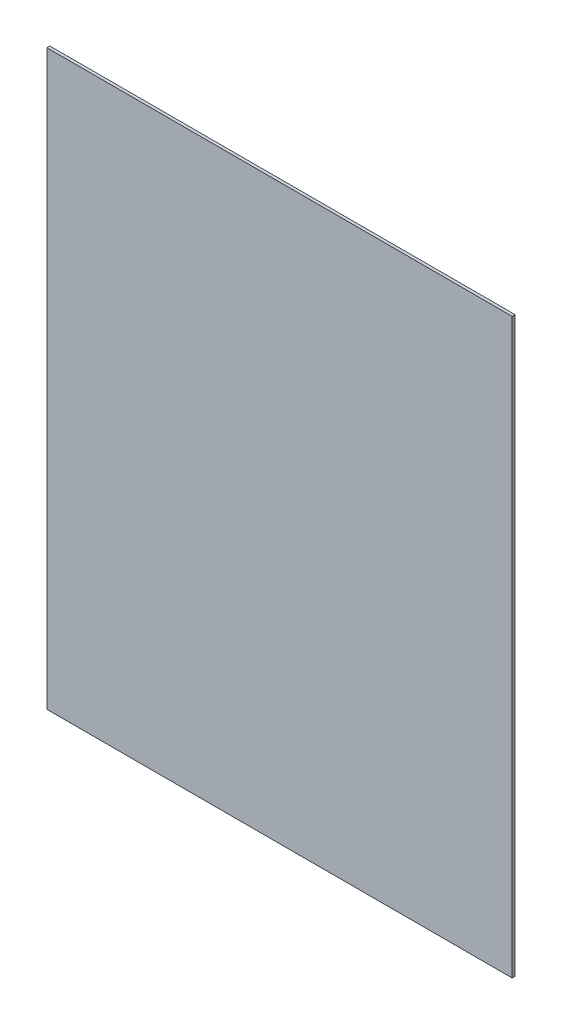
ISO-10303-21;
HEADER;
FILE_DESCRIPTION(('STEP AP214'),'2;1');
FILE_NAME('part.step','',(''),(''),'','','');
FILE_SCHEMA(('AUTOMOTIVE_DESIGN { 1 0 10303 214 1 1 1 1 }'));
ENDSEC;
DATA;
#1=APPLICATION_CONTEXT('core data for automotive mechanical design processes');
#2=APPLICATION_PROTOCOL_DEFINITION('international standard','automotive_design',2000,#1);
#3=PRODUCT_CONTEXT('',#1,'mechanical');
#4=PRODUCT('Part','Part','',(#3));
#5=PRODUCT_RELATED_PRODUCT_CATEGORY('part','',(#4));
#6=PRODUCT_DEFINITION_FORMATION('','',#4);
#7=PRODUCT_DEFINITION_CONTEXT('part definition',#1,'design');
#8=PRODUCT_DEFINITION('design','',#6,#7);
#9=PRODUCT_DEFINITION_SHAPE('','',#8);
#10=(LENGTH_UNIT() NAMED_UNIT(*) SI_UNIT(.MILLI.,.METRE.));
#11=(NAMED_UNIT(*) PLANE_ANGLE_UNIT() SI_UNIT($,.RADIAN.));
#12=(NAMED_UNIT(*) SI_UNIT($,.STERADIAN.) SOLID_ANGLE_UNIT());
#13=UNCERTAINTY_MEASURE_WITH_UNIT(LENGTH_MEASURE(1.E-05),#10,'distance_accuracy_value','');
#14=(GEOMETRIC_REPRESENTATION_CONTEXT(3) GLOBAL_UNCERTAINTY_ASSIGNED_CONTEXT((#13)) GLOBAL_UNIT_ASSIGNED_CONTEXT((#10,
#11,#12)) REPRESENTATION_CONTEXT('',''));
#15=CARTESIAN_POINT('',(0.,0.,0.));
#16=DIRECTION('',(0.,0.,1.));
#17=DIRECTION('',(1.,0.,0.));
#18=AXIS2_PLACEMENT_3D('',#15,#16,#17);
#19=CARTESIAN_POINT('',(14.25,17.55,0.18));
#20=DIRECTION('',(-1.,0.,0.));
#21=DIRECTION('',(0.,0.,1.));
#22=AXIS2_PLACEMENT_3D('',#19,#20,#21);
#23=PLANE('',#22);
#24=DIRECTION('',(0.,1.,0.));
#25=VECTOR('',#24,1.);
#26=CARTESIAN_POINT('',(14.25,17.55,0.));
#27=LINE('',#26,#25);
#28=CARTESIAN_POINT('',(14.25,-17.55,0.));
#29=VERTEX_POINT('',#28);
#30=CARTESIAN_POINT('',(14.25,17.55,0.));
#31=VERTEX_POINT('',#30);
#32=EDGE_CURVE('E101',#29,#31,#27,.T.);
#33=ORIENTED_EDGE('',*,*,#32,.T.);
#34=DIRECTION('',(0.,0.,-1.));
#35=VECTOR('',#34,1.);
#36=CARTESIAN_POINT('',(14.25,17.55,0.18));
#37=LINE('',#36,#35);
#38=CARTESIAN_POINT('',(14.25,17.55,0.18));
#39=VERTEX_POINT('',#38);
#40=EDGE_CURVE('E11',#39,#31,#37,.T.);
#41=ORIENTED_EDGE('',*,*,#40,.F.);
#42=DIRECTION('',(0.,1.,0.));
#43=VECTOR('',#42,1.);
#44=CARTESIAN_POINT('',(14.25,17.55,0.18));
#45=LINE('',#44,#43);
#46=CARTESIAN_POINT('',(14.25,-17.55,0.18));
#47=VERTEX_POINT('',#46);
#48=EDGE_CURVE('E89',#47,#39,#45,.T.);
#49=ORIENTED_EDGE('',*,*,#48,.F.);
#50=DIRECTION('',(0.,0.,-1.));
#51=VECTOR('',#50,1.);
#52=CARTESIAN_POINT('',(14.25,-17.55,0.18));
#53=LINE('',#52,#51);
#54=EDGE_CURVE('E97',#47,#29,#53,.T.);
#55=ORIENTED_EDGE('',*,*,#54,.T.);
#56=EDGE_LOOP('',(#33,#41,#49,#55));
#57=FACE_BOUND('',#56,.T.);
#58=ADVANCED_FACE('F38',(#57),#23,.F.);
#59=CARTESIAN_POINT('',(-14.25,17.55,0.18));
#60=DIRECTION('',(0.,-1.,0.));
#61=DIRECTION('',(0.,0.,-1.));
#62=AXIS2_PLACEMENT_3D('',#59,#60,#61);
#63=PLANE('',#62);
#64=DIRECTION('',(-1.,0.,0.));
#65=VECTOR('',#64,1.);
#66=CARTESIAN_POINT('',(-14.25,17.55,0.));
#67=LINE('',#66,#65);
#68=CARTESIAN_POINT('',(-14.25,17.55,0.));
#69=VERTEX_POINT('',#68);
#70=EDGE_CURVE('E93',#31,#69,#67,.T.);
#71=ORIENTED_EDGE('',*,*,#70,.T.);
#72=DIRECTION('',(0.,0.,-1.));
#73=VECTOR('',#72,1.);
#74=CARTESIAN_POINT('',(-14.25,17.55,0.18));
#75=LINE('',#74,#73);
#76=CARTESIAN_POINT('',(-14.25,17.55,0.18));
#77=VERTEX_POINT('',#76);
#78=EDGE_CURVE('E46',#77,#69,#75,.T.);
#79=ORIENTED_EDGE('',*,*,#78,.F.);
#80=DIRECTION('',(-1.,0.,0.));
#81=VECTOR('',#80,1.);
#82=CARTESIAN_POINT('',(-14.25,17.55,0.18));
#83=LINE('',#82,#81);
#84=EDGE_CURVE('E84',#39,#77,#83,.T.);
#85=ORIENTED_EDGE('',*,*,#84,.F.);
#86=ORIENTED_EDGE('',*,*,#40,.T.);
#87=EDGE_LOOP('',(#71,#79,#85,#86));
#88=FACE_BOUND('',#87,.T.);
#89=ADVANCED_FACE('F92',(#88),#63,.F.);
#90=CARTESIAN_POINT('',(-14.25,17.55,0.18));
#91=DIRECTION('',(1.,0.,0.));
#92=DIRECTION('',(0.,1.,0.));
#93=AXIS2_PLACEMENT_3D('',#90,#91,#92);
#94=PLANE('',#93);
#95=DIRECTION('',(0.,-1.,0.));
#96=VECTOR('',#95,1.);
#97=CARTESIAN_POINT('',(-14.25,17.55,0.));
#98=LINE('',#97,#96);
#99=CARTESIAN_POINT('',(-14.25,-17.55,0.));
#100=VERTEX_POINT('',#99);
#101=EDGE_CURVE('E71',#69,#100,#98,.T.);
#102=ORIENTED_EDGE('',*,*,#101,.T.);
#103=DIRECTION('',(0.,0.,-1.));
#104=VECTOR('',#103,1.);
#105=CARTESIAN_POINT('',(-14.25,-17.55,0.18));
#106=LINE('',#105,#104);
#107=CARTESIAN_POINT('',(-14.25,-17.55,0.18));
#108=VERTEX_POINT('',#107);
#109=EDGE_CURVE('E94',#108,#100,#106,.T.);
#110=ORIENTED_EDGE('',*,*,#109,.F.);
#111=DIRECTION('',(0.,-1.,0.));
#112=VECTOR('',#111,1.);
#113=CARTESIAN_POINT('',(-14.25,17.55,0.18));
#114=LINE('',#113,#112);
#115=EDGE_CURVE('E87',#77,#108,#114,.T.);
#116=ORIENTED_EDGE('',*,*,#115,.F.);
#117=ORIENTED_EDGE('',*,*,#78,.T.);
#118=EDGE_LOOP('',(#102,#110,#116,#117));
#119=FACE_BOUND('',#118,.T.);
#120=ADVANCED_FACE('F95',(#119),#94,.F.);
#121=CARTESIAN_POINT('',(-14.25,-17.55,0.18));
#122=DIRECTION('',(0.,1.,0.));
#123=DIRECTION('',(0.,0.,1.));
#124=AXIS2_PLACEMENT_3D('',#121,#122,#123);
#125=PLANE('',#124);
#126=DIRECTION('',(1.,0.,0.));
#127=VECTOR('',#126,1.);
#128=CARTESIAN_POINT('',(-14.25,-17.55,0.));
#129=LINE('',#128,#127);
#130=EDGE_CURVE('E77',#100,#29,#129,.T.);
#131=ORIENTED_EDGE('',*,*,#130,.T.);
#132=ORIENTED_EDGE('',*,*,#54,.F.);
#133=DIRECTION('',(1.,0.,0.));
#134=VECTOR('',#133,1.);
#135=CARTESIAN_POINT('',(-14.25,-17.55,0.18));
#136=LINE('',#135,#134);
#137=EDGE_CURVE('E54',#108,#47,#136,.T.);
#138=ORIENTED_EDGE('',*,*,#137,.F.);
#139=ORIENTED_EDGE('',*,*,#109,.T.);
#140=EDGE_LOOP('',(#131,#132,#138,#139));
#141=FACE_BOUND('',#140,.T.);
#142=ADVANCED_FACE('F108',(#141),#125,.F.);
#143=CARTESIAN_POINT('',(0.,0.,0.18));
#144=DIRECTION('',(0.,0.,1.));
#145=DIRECTION('',(1.,0.,0.));
#146=AXIS2_PLACEMENT_3D('',#143,#144,#145);
#147=PLANE('',#146);
#148=ORIENTED_EDGE('',*,*,#48,.T.);
#149=ORIENTED_EDGE('',*,*,#84,.T.);
#150=ORIENTED_EDGE('',*,*,#115,.T.);
#151=ORIENTED_EDGE('',*,*,#137,.T.);
#152=EDGE_LOOP('',(#148,#149,#150,#151));
#153=FACE_BOUND('',#152,.T.);
#154=ADVANCED_FACE('F85',(#153),#147,.T.);
#155=CARTESIAN_POINT('',(0.,0.,0.));
#156=DIRECTION('',(0.,0.,1.));
#157=DIRECTION('',(1.,0.,0.));
#158=AXIS2_PLACEMENT_3D('',#155,#156,#157);
#159=PLANE('',#158);
#160=ORIENTED_EDGE('',*,*,#32,.F.);
#161=ORIENTED_EDGE('',*,*,#130,.F.);
#162=ORIENTED_EDGE('',*,*,#101,.F.);
#163=ORIENTED_EDGE('',*,*,#70,.F.);
#164=EDGE_LOOP('',(#160,#161,#162,#163));
#165=FACE_BOUND('',#164,.T.);
#166=ADVANCED_FACE('F111',(#165),#159,.F.);
#167=CLOSED_SHELL('',(#58,#89,#120,#142,#154,#166));
#168=MANIFOLD_SOLID_BREP('B2',#167);
#169=ADVANCED_BREP_SHAPE_REPRESENTATION('',(#18,#168),#14);
#170=SHAPE_DEFINITION_REPRESENTATION(#9,#169);
ENDSEC;
END-ISO-10303-21;
